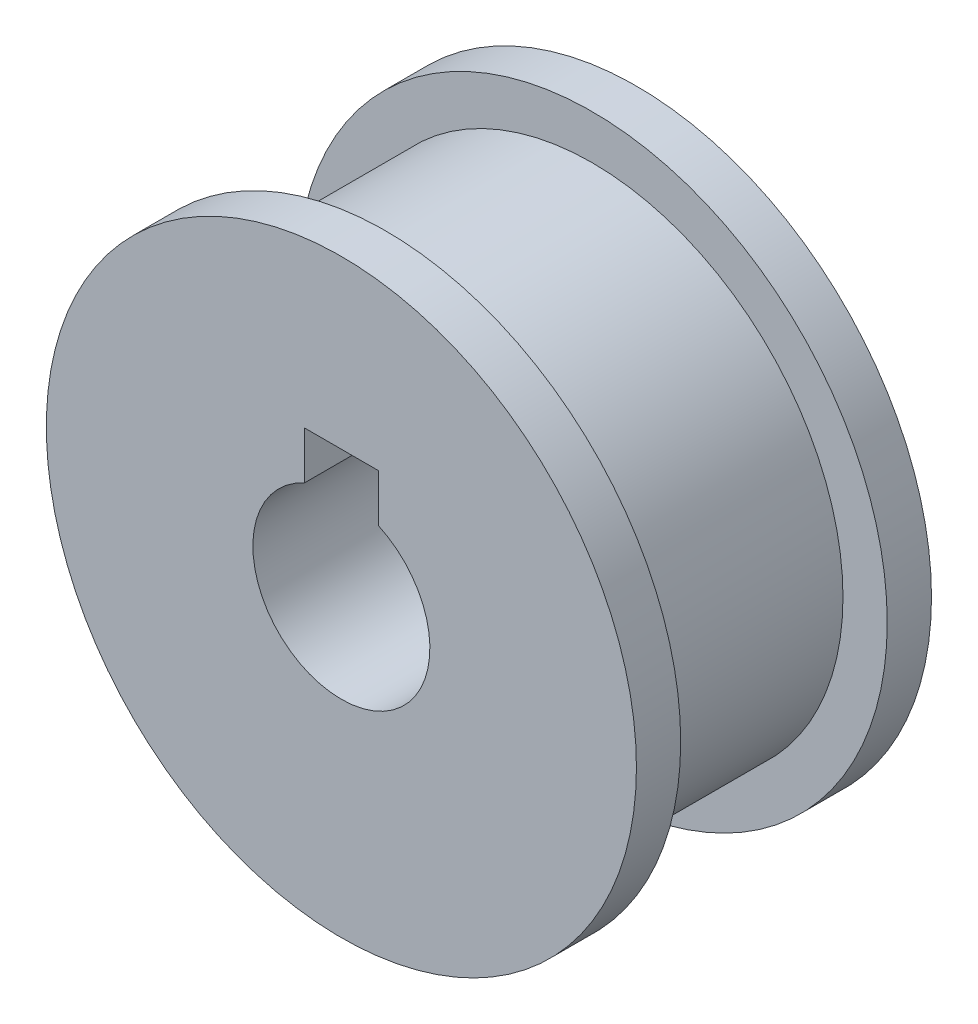
ISO-10303-21;
HEADER;
FILE_DESCRIPTION(('STEP AP214'),'2;1');
FILE_NAME('part.step','',(''),(''),'','','');
FILE_SCHEMA(('AUTOMOTIVE_DESIGN { 1 0 10303 214 1 1 1 1 }'));
ENDSEC;
DATA;
#1=APPLICATION_CONTEXT('core data for automotive mechanical design processes');
#2=APPLICATION_PROTOCOL_DEFINITION('international standard','automotive_design',2000,#1);
#3=PRODUCT_CONTEXT('',#1,'mechanical');
#4=PRODUCT('Part','Part','',(#3));
#5=PRODUCT_RELATED_PRODUCT_CATEGORY('part','',(#4));
#6=PRODUCT_DEFINITION_FORMATION('','',#4);
#7=PRODUCT_DEFINITION_CONTEXT('part definition',#1,'design');
#8=PRODUCT_DEFINITION('design','',#6,#7);
#9=PRODUCT_DEFINITION_SHAPE('','',#8);
#10=(LENGTH_UNIT() NAMED_UNIT(*) SI_UNIT(.MILLI.,.METRE.));
#11=(NAMED_UNIT(*) PLANE_ANGLE_UNIT() SI_UNIT($,.RADIAN.));
#12=(NAMED_UNIT(*) SI_UNIT($,.STERADIAN.) SOLID_ANGLE_UNIT());
#13=UNCERTAINTY_MEASURE_WITH_UNIT(LENGTH_MEASURE(1.E-05),#10,'distance_accuracy_value','');
#14=(GEOMETRIC_REPRESENTATION_CONTEXT(3) GLOBAL_UNCERTAINTY_ASSIGNED_CONTEXT((#13)) GLOBAL_UNIT_ASSIGNED_CONTEXT((#10,
#11,#12)) REPRESENTATION_CONTEXT('',''));
#15=CARTESIAN_POINT('',(0.,0.,0.));
#16=DIRECTION('',(0.,0.,1.));
#17=DIRECTION('',(1.,0.,0.));
#18=AXIS2_PLACEMENT_3D('',#15,#16,#17);
#19=CARTESIAN_POINT('',(0.,0.,10.));
#20=DIRECTION('',(0.,0.,-1.));
#21=DIRECTION('',(-1.,0.,0.));
#22=AXIS2_PLACEMENT_3D('',#19,#20,#21);
#23=CYLINDRICAL_SURFACE('',#22,17.);
#24=CARTESIAN_POINT('',(0.,0.,7.));
#25=DIRECTION('',(0.,0.,1.));
#26=DIRECTION('',(1.,0.,0.));
#27=AXIS2_PLACEMENT_3D('',#24,#25,#26);
#28=CIRCLE('',#27,17.);
#29=CARTESIAN_POINT('',(17.,0.,7.));
#30=VERTEX_POINT('',#29);
#31=EDGE_CURVE('E46',#30,#30,#28,.T.);
#32=ORIENTED_EDGE('',*,*,#31,.F.);
#33=EDGE_LOOP('',(#32));
#34=FACE_BOUND('',#33,.T.);
#35=CARTESIAN_POINT('',(0.,0.,-7.));
#36=DIRECTION('',(0.,0.,-1.));
#37=DIRECTION('',(-1.,0.,0.));
#38=AXIS2_PLACEMENT_3D('',#35,#36,#37);
#39=CIRCLE('',#38,17.);
#40=CARTESIAN_POINT('',(-17.,0.,-7.));
#41=VERTEX_POINT('',#40);
#42=EDGE_CURVE('E11',#41,#41,#39,.T.);
#43=ORIENTED_EDGE('',*,*,#42,.F.);
#44=EDGE_LOOP('',(#43));
#45=FACE_BOUND('',#44,.T.);
#46=ADVANCED_FACE('F39',(#34,#45),#23,.T.);
#47=CARTESIAN_POINT('',(0.,0.,7.));
#48=DIRECTION('',(0.,0.,1.));
#49=DIRECTION('',(1.,0.,0.));
#50=AXIS2_PLACEMENT_3D('',#47,#48,#49);
#51=CYLINDRICAL_SURFACE('',#50,20.);
#52=CARTESIAN_POINT('',(0.,0.,7.));
#53=DIRECTION('',(0.,0.,1.));
#54=DIRECTION('',(1.,0.,0.));
#55=AXIS2_PLACEMENT_3D('',#52,#53,#54);
#56=CIRCLE('',#55,20.);
#57=CARTESIAN_POINT('',(20.,0.,7.));
#58=VERTEX_POINT('',#57);
#59=EDGE_CURVE('E122',#58,#58,#56,.T.);
#60=ORIENTED_EDGE('',*,*,#59,.T.);
#61=EDGE_LOOP('',(#60));
#62=FACE_BOUND('',#61,.T.);
#63=CARTESIAN_POINT('',(0.,0.,10.));
#64=DIRECTION('',(0.,0.,1.));
#65=DIRECTION('',(1.,0.,0.));
#66=AXIS2_PLACEMENT_3D('',#63,#64,#65);
#67=CIRCLE('',#66,20.);
#68=CARTESIAN_POINT('',(20.,0.,10.));
#69=VERTEX_POINT('',#68);
#70=EDGE_CURVE('E119',#69,#69,#67,.T.);
#71=ORIENTED_EDGE('',*,*,#70,.F.);
#72=EDGE_LOOP('',(#71));
#73=FACE_BOUND('',#72,.T.);
#74=ADVANCED_FACE('F134',(#62,#73),#51,.T.);
#75=CARTESIAN_POINT('',(0.,0.,7.));
#76=DIRECTION('',(0.,0.,1.));
#77=DIRECTION('',(1.,0.,0.));
#78=AXIS2_PLACEMENT_3D('',#75,#76,#77);
#79=PLANE('',#78);
#80=ORIENTED_EDGE('',*,*,#31,.T.);
#81=EDGE_LOOP('',(#80));
#82=FACE_BOUND('',#81,.T.);
#83=ORIENTED_EDGE('',*,*,#59,.F.);
#84=EDGE_LOOP('',(#83));
#85=FACE_BOUND('',#84,.T.);
#86=ADVANCED_FACE('F129',(#82,#85),#79,.F.);
#87=CARTESIAN_POINT('',(0.,0.,10.));
#88=DIRECTION('',(0.,0.,1.));
#89=DIRECTION('',(1.,0.,0.));
#90=AXIS2_PLACEMENT_3D('',#87,#88,#89);
#91=PLANE('',#90);
#92=CARTESIAN_POINT('',(0.,0.,10.));
#93=DIRECTION('',(0.,0.,1.));
#94=DIRECTION('',(1.,0.,0.));
#95=AXIS2_PLACEMENT_3D('',#92,#93,#94);
#96=CIRCLE('',#95,6.);
#97=CARTESIAN_POINT('',(-2.5,5.45435605731786,10.));
#98=VERTEX_POINT('',#97);
#99=CARTESIAN_POINT('',(2.5,5.45435605731786,10.));
#100=VERTEX_POINT('',#99);
#101=EDGE_CURVE('E53',#98,#100,#96,.T.);
#102=ORIENTED_EDGE('',*,*,#101,.F.);
#103=DIRECTION('',(0.,-1.,0.));
#104=VECTOR('',#103,1.);
#105=CARTESIAN_POINT('',(-2.5,8.68,10.));
#106=LINE('',#105,#104);
#107=CARTESIAN_POINT('',(-2.5,8.68,10.));
#108=VERTEX_POINT('',#107);
#109=EDGE_CURVE('E97',#108,#98,#106,.T.);
#110=ORIENTED_EDGE('',*,*,#109,.F.);
#111=DIRECTION('',(-1.,0.,0.));
#112=VECTOR('',#111,1.);
#113=CARTESIAN_POINT('',(2.5,8.68,10.));
#114=LINE('',#113,#112);
#115=CARTESIAN_POINT('',(2.5,8.68,10.));
#116=VERTEX_POINT('',#115);
#117=EDGE_CURVE('E100',#116,#108,#114,.T.);
#118=ORIENTED_EDGE('',*,*,#117,.F.);
#119=DIRECTION('',(0.,1.,0.));
#120=VECTOR('',#119,1.);
#121=CARTESIAN_POINT('',(2.5,8.68,10.));
#122=LINE('',#121,#120);
#123=EDGE_CURVE('E106',#100,#116,#122,.T.);
#124=ORIENTED_EDGE('',*,*,#123,.F.);
#125=EDGE_LOOP('',(#102,#110,#118,#124));
#126=FACE_BOUND('',#125,.T.);
#127=ORIENTED_EDGE('',*,*,#70,.T.);
#128=EDGE_LOOP('',(#127));
#129=FACE_BOUND('',#128,.T.);
#130=ADVANCED_FACE('F146',(#126,#129),#91,.T.);
#131=CARTESIAN_POINT('',(0.,0.,-7.));
#132=DIRECTION('',(0.,0.,-1.));
#133=DIRECTION('',(-1.,0.,0.));
#134=AXIS2_PLACEMENT_3D('',#131,#132,#133);
#135=CYLINDRICAL_SURFACE('',#134,20.);
#136=CARTESIAN_POINT('',(0.,0.,-7.));
#137=DIRECTION('',(0.,0.,1.));
#138=DIRECTION('',(1.,0.,0.));
#139=AXIS2_PLACEMENT_3D('',#136,#137,#138);
#140=CIRCLE('',#139,20.);
#141=CARTESIAN_POINT('',(20.,0.,-7.));
#142=VERTEX_POINT('',#141);
#143=EDGE_CURVE('E116',#142,#142,#140,.T.);
#144=ORIENTED_EDGE('',*,*,#143,.F.);
#145=EDGE_LOOP('',(#144));
#146=FACE_BOUND('',#145,.T.);
#147=CARTESIAN_POINT('',(0.,0.,-10.));
#148=DIRECTION('',(0.,0.,1.));
#149=DIRECTION('',(1.,0.,0.));
#150=AXIS2_PLACEMENT_3D('',#147,#148,#149);
#151=CIRCLE('',#150,20.);
#152=CARTESIAN_POINT('',(20.,0.,-10.));
#153=VERTEX_POINT('',#152);
#154=EDGE_CURVE('E112',#153,#153,#151,.T.);
#155=ORIENTED_EDGE('',*,*,#154,.T.);
#156=EDGE_LOOP('',(#155));
#157=FACE_BOUND('',#156,.T.);
#158=ADVANCED_FACE('F140',(#146,#157),#135,.T.);
#159=CARTESIAN_POINT('',(0.,0.,-7.));
#160=DIRECTION('',(0.,0.,-1.));
#161=DIRECTION('',(1.,0.,0.));
#162=AXIS2_PLACEMENT_3D('',#159,#160,#161);
#163=PLANE('',#162);
#164=ORIENTED_EDGE('',*,*,#42,.T.);
#165=EDGE_LOOP('',(#164));
#166=FACE_BOUND('',#165,.T.);
#167=ORIENTED_EDGE('',*,*,#143,.T.);
#168=EDGE_LOOP('',(#167));
#169=FACE_BOUND('',#168,.T.);
#170=ADVANCED_FACE('F137',(#166,#169),#163,.F.);
#171=CARTESIAN_POINT('',(0.,0.,-10.));
#172=DIRECTION('',(0.,0.,1.));
#173=DIRECTION('',(1.,0.,0.));
#174=AXIS2_PLACEMENT_3D('',#171,#172,#173);
#175=PLANE('',#174);
#176=DIRECTION('',(0.,-1.,0.));
#177=VECTOR('',#176,1.);
#178=CARTESIAN_POINT('',(-2.5,8.68,-10.));
#179=LINE('',#178,#177);
#180=CARTESIAN_POINT('',(-2.5,8.68,-10.));
#181=VERTEX_POINT('',#180);
#182=CARTESIAN_POINT('',(-2.5,5.45435605731786,-10.));
#183=VERTEX_POINT('',#182);
#184=EDGE_CURVE('E87',#181,#183,#179,.T.);
#185=ORIENTED_EDGE('',*,*,#184,.T.);
#186=CARTESIAN_POINT('',(0.,0.,-10.));
#187=DIRECTION('',(0.,0.,1.));
#188=DIRECTION('',(1.,0.,0.));
#189=AXIS2_PLACEMENT_3D('',#186,#187,#188);
#190=CIRCLE('',#189,6.);
#191=CARTESIAN_POINT('',(2.5,5.45435605731786,-10.));
#192=VERTEX_POINT('',#191);
#193=EDGE_CURVE('E81',#183,#192,#190,.T.);
#194=ORIENTED_EDGE('',*,*,#193,.T.);
#195=DIRECTION('',(0.,1.,0.));
#196=VECTOR('',#195,1.);
#197=CARTESIAN_POINT('',(2.5,8.68,-10.));
#198=LINE('',#197,#196);
#199=CARTESIAN_POINT('',(2.5,8.68,-10.));
#200=VERTEX_POINT('',#199);
#201=EDGE_CURVE('E90',#192,#200,#198,.T.);
#202=ORIENTED_EDGE('',*,*,#201,.T.);
#203=DIRECTION('',(-1.,0.,0.));
#204=VECTOR('',#203,1.);
#205=CARTESIAN_POINT('',(2.5,8.68,-10.));
#206=LINE('',#205,#204);
#207=EDGE_CURVE('E61',#200,#181,#206,.T.);
#208=ORIENTED_EDGE('',*,*,#207,.T.);
#209=EDGE_LOOP('',(#185,#194,#202,#208));
#210=FACE_BOUND('',#209,.T.);
#211=ORIENTED_EDGE('',*,*,#154,.F.);
#212=EDGE_LOOP('',(#211));
#213=FACE_BOUND('',#212,.T.);
#214=ADVANCED_FACE('F94',(#210,#213),#175,.F.);
#215=CARTESIAN_POINT('',(0.,0.,-10.));
#216=DIRECTION('',(0.,0.,1.));
#217=DIRECTION('',(1.,0.,0.));
#218=AXIS2_PLACEMENT_3D('',#215,#216,#217);
#219=CYLINDRICAL_SURFACE('',#218,6.);
#220=ORIENTED_EDGE('',*,*,#101,.T.);
#221=DIRECTION('',(0.,0.,1.));
#222=VECTOR('',#221,1.);
#223=CARTESIAN_POINT('',(2.5,5.45435605731786,-10.));
#224=LINE('',#223,#222);
#225=EDGE_CURVE('E77',#192,#100,#224,.T.);
#226=ORIENTED_EDGE('',*,*,#225,.F.);
#227=ORIENTED_EDGE('',*,*,#193,.F.);
#228=DIRECTION('',(0.,0.,1.));
#229=VECTOR('',#228,1.);
#230=CARTESIAN_POINT('',(-2.5,5.45435605731786,-10.));
#231=LINE('',#230,#229);
#232=EDGE_CURVE('E110',#183,#98,#231,.T.);
#233=ORIENTED_EDGE('',*,*,#232,.T.);
#234=EDGE_LOOP('',(#220,#226,#227,#233));
#235=FACE_BOUND('',#234,.T.);
#236=ADVANCED_FACE('F79',(#235),#219,.F.);
#237=CARTESIAN_POINT('',(-2.5,8.68,-10.));
#238=DIRECTION('',(-1.,0.,0.));
#239=DIRECTION('',(0.,0.,1.));
#240=AXIS2_PLACEMENT_3D('',#237,#238,#239);
#241=PLANE('',#240);
#242=ORIENTED_EDGE('',*,*,#109,.T.);
#243=ORIENTED_EDGE('',*,*,#232,.F.);
#244=ORIENTED_EDGE('',*,*,#184,.F.);
#245=DIRECTION('',(0.,0.,1.));
#246=VECTOR('',#245,1.);
#247=CARTESIAN_POINT('',(-2.5,8.68,-10.));
#248=LINE('',#247,#246);
#249=EDGE_CURVE('E113',#181,#108,#248,.T.);
#250=ORIENTED_EDGE('',*,*,#249,.T.);
#251=EDGE_LOOP('',(#242,#243,#244,#250));
#252=FACE_BOUND('',#251,.T.);
#253=ADVANCED_FACE('F153',(#252),#241,.F.);
#254=CARTESIAN_POINT('',(2.5,8.68,-10.));
#255=DIRECTION('',(0.,1.,0.));
#256=DIRECTION('',(0.,0.,1.));
#257=AXIS2_PLACEMENT_3D('',#254,#255,#256);
#258=PLANE('',#257);
#259=ORIENTED_EDGE('',*,*,#117,.T.);
#260=ORIENTED_EDGE('',*,*,#249,.F.);
#261=ORIENTED_EDGE('',*,*,#207,.F.);
#262=DIRECTION('',(0.,0.,1.));
#263=VECTOR('',#262,1.);
#264=CARTESIAN_POINT('',(2.5,8.68,-10.));
#265=LINE('',#264,#263);
#266=EDGE_CURVE('E86',#200,#116,#265,.T.);
#267=ORIENTED_EDGE('',*,*,#266,.T.);
#268=EDGE_LOOP('',(#259,#260,#261,#267));
#269=FACE_BOUND('',#268,.T.);
#270=ADVANCED_FACE('F166',(#269),#258,.F.);
#271=CARTESIAN_POINT('',(2.5,8.68,-10.));
#272=DIRECTION('',(1.,0.,0.));
#273=DIRECTION('',(0.,0.,-1.));
#274=AXIS2_PLACEMENT_3D('',#271,#272,#273);
#275=PLANE('',#274);
#276=ORIENTED_EDGE('',*,*,#123,.T.);
#277=ORIENTED_EDGE('',*,*,#266,.F.);
#278=ORIENTED_EDGE('',*,*,#201,.F.);
#279=ORIENTED_EDGE('',*,*,#225,.T.);
#280=EDGE_LOOP('',(#276,#277,#278,#279));
#281=FACE_BOUND('',#280,.T.);
#282=ADVANCED_FACE('F91',(#281),#275,.F.);
#283=CLOSED_SHELL('',(#46,#74,#86,#130,#158,#170,#214,#236,#253,#270,#282));
#284=MANIFOLD_SOLID_BREP('B2',#283);
#285=ADVANCED_BREP_SHAPE_REPRESENTATION('',(#18,#284),#14);
#286=SHAPE_DEFINITION_REPRESENTATION(#9,#285);
ENDSEC;
END-ISO-10303-21;
